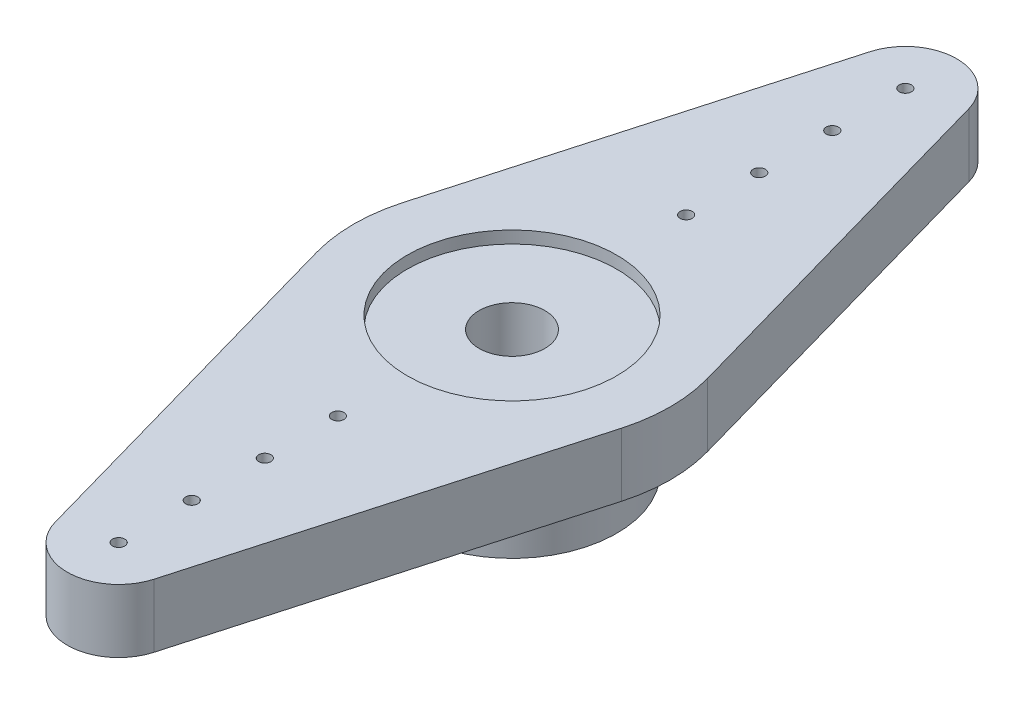
ISO-10303-21;
HEADER;
FILE_DESCRIPTION(('STEP AP214'),'2;1');
FILE_NAME('part.step','',(''),(''),'','','');
FILE_SCHEMA(('AUTOMOTIVE_DESIGN { 1 0 10303 214 1 1 1 1 }'));
ENDSEC;
DATA;
#1=APPLICATION_CONTEXT('core data for automotive mechanical design processes');
#2=APPLICATION_PROTOCOL_DEFINITION('international standard','automotive_design',2000,#1);
#3=PRODUCT_CONTEXT('',#1,'mechanical');
#4=PRODUCT('Part','Part','',(#3));
#5=PRODUCT_RELATED_PRODUCT_CATEGORY('part','',(#4));
#6=PRODUCT_DEFINITION_FORMATION('','',#4);
#7=PRODUCT_DEFINITION_CONTEXT('part definition',#1,'design');
#8=PRODUCT_DEFINITION('design','',#6,#7);
#9=PRODUCT_DEFINITION_SHAPE('','',#8);
#10=(LENGTH_UNIT() NAMED_UNIT(*) SI_UNIT(.MILLI.,.METRE.));
#11=(NAMED_UNIT(*) PLANE_ANGLE_UNIT() SI_UNIT($,.RADIAN.));
#12=(NAMED_UNIT(*) SI_UNIT($,.STERADIAN.) SOLID_ANGLE_UNIT());
#13=UNCERTAINTY_MEASURE_WITH_UNIT(LENGTH_MEASURE(1.E-05),#10,'distance_accuracy_value','');
#14=(GEOMETRIC_REPRESENTATION_CONTEXT(3) GLOBAL_UNCERTAINTY_ASSIGNED_CONTEXT((#13)) GLOBAL_UNIT_ASSIGNED_CONTEXT((#10,
#11,#12)) REPRESENTATION_CONTEXT('',''));
#15=CARTESIAN_POINT('',(0.,0.,0.));
#16=DIRECTION('',(0.,0.,1.));
#17=DIRECTION('',(1.,0.,0.));
#18=AXIS2_PLACEMENT_3D('',#15,#16,#17);
#19=CARTESIAN_POINT('',(0.,3.,0.));
#20=DIRECTION('',(0.,-1.,0.));
#21=DIRECTION('',(0.,0.,-1.));
#22=AXIS2_PLACEMENT_3D('',#19,#20,#21);
#23=CYLINDRICAL_SURFACE('',#22,4.3);
#24=CARTESIAN_POINT('',(0.,0.,0.));
#25=DIRECTION('',(0.,1.,0.));
#26=DIRECTION('',(0.,0.,1.));
#27=AXIS2_PLACEMENT_3D('',#24,#25,#26);
#28=CIRCLE('',#27,4.3);
#29=CARTESIAN_POINT('',(0.,0.,4.3));
#30=VERTEX_POINT('',#29);
#31=EDGE_CURVE('E53',#30,#30,#28,.T.);
#32=ORIENTED_EDGE('',*,*,#31,.T.);
#33=EDGE_LOOP('',(#32));
#34=FACE_BOUND('',#33,.T.);
#35=CARTESIAN_POINT('',(0.,3.,0.));
#36=DIRECTION('',(0.,1.,0.));
#37=DIRECTION('',(0.,0.,1.));
#38=AXIS2_PLACEMENT_3D('',#35,#36,#37);
#39=CIRCLE('',#38,4.3);
#40=CARTESIAN_POINT('',(0.,3.,4.3));
#41=VERTEX_POINT('',#40);
#42=EDGE_CURVE('E11',#41,#41,#39,.T.);
#43=ORIENTED_EDGE('',*,*,#42,.F.);
#44=EDGE_LOOP('',(#43));
#45=FACE_BOUND('',#44,.T.);
#46=ADVANCED_FACE('F45',(#34,#45),#23,.T.);
#47=CARTESIAN_POINT('',(0.,0.,0.));
#48=DIRECTION('',(0.,1.,0.));
#49=DIRECTION('',(0.,0.,1.));
#50=AXIS2_PLACEMENT_3D('',#47,#48,#49);
#51=PLANE('',#50);
#52=ORIENTED_EDGE('',*,*,#31,.F.);
#53=EDGE_LOOP('',(#52));
#54=FACE_BOUND('',#53,.T.);
#55=CARTESIAN_POINT('',(0.,0.,0.));
#56=DIRECTION('',(0.,1.,0.));
#57=DIRECTION('',(0.,0.,1.));
#58=AXIS2_PLACEMENT_3D('',#55,#56,#57);
#59=CIRCLE('',#58,2.75);
#60=CARTESIAN_POINT('',(0.,0.,2.75));
#61=VERTEX_POINT('',#60);
#62=EDGE_CURVE('E258',#61,#61,#59,.T.);
#63=ORIENTED_EDGE('',*,*,#62,.T.);
#64=EDGE_LOOP('',(#63));
#65=FACE_BOUND('',#64,.T.);
#66=ADVANCED_FACE('F267',(#54,#65),#51,.F.);
#67=CARTESIAN_POINT('',(0.,3.,0.));
#68=DIRECTION('',(0.,-1.,0.));
#69=DIRECTION('',(0.,0.,-1.));
#70=AXIS2_PLACEMENT_3D('',#67,#68,#69);
#71=CYLINDRICAL_SURFACE('',#70,2.75);
#72=CARTESIAN_POINT('',(0.,3.,0.));
#73=DIRECTION('',(0.,1.,0.));
#74=DIRECTION('',(0.,0.,1.));
#75=AXIS2_PLACEMENT_3D('',#72,#73,#74);
#76=CIRCLE('',#75,2.75);
#77=CARTESIAN_POINT('',(0.,3.,2.75));
#78=VERTEX_POINT('',#77);
#79=EDGE_CURVE('E251',#78,#78,#76,.T.);
#80=ORIENTED_EDGE('',*,*,#79,.T.);
#81=EDGE_LOOP('',(#80));
#82=FACE_BOUND('',#81,.T.);
#83=ORIENTED_EDGE('',*,*,#62,.F.);
#84=EDGE_LOOP('',(#83));
#85=FACE_BOUND('',#84,.T.);
#86=ADVANCED_FACE('F270',(#82,#85),#71,.F.);
#87=CARTESIAN_POINT('',(0.,3.,0.));
#88=DIRECTION('',(0.,1.,0.));
#89=DIRECTION('',(0.,0.,1.));
#90=AXIS2_PLACEMENT_3D('',#87,#88,#89);
#91=PLANE('',#90);
#92=CARTESIAN_POINT('',(0.,3.,0.));
#93=DIRECTION('',(0.,1.,0.));
#94=DIRECTION('',(0.,0.,1.));
#95=AXIS2_PLACEMENT_3D('',#92,#93,#94);
#96=CIRCLE('',#95,1.35);
#97=CARTESIAN_POINT('',(0.,3.,1.35));
#98=VERTEX_POINT('',#97);
#99=EDGE_CURVE('E246',#98,#98,#96,.T.);
#100=ORIENTED_EDGE('',*,*,#99,.T.);
#101=EDGE_LOOP('',(#100));
#102=FACE_BOUND('',#101,.T.);
#103=ORIENTED_EDGE('',*,*,#79,.F.);
#104=EDGE_LOOP('',(#103));
#105=FACE_BOUND('',#104,.T.);
#106=ADVANCED_FACE('F274',(#102,#105),#91,.F.);
#107=CARTESIAN_POINT('',(0.,5.1,0.));
#108=DIRECTION('',(0.,1.,0.));
#109=DIRECTION('',(0.,0.,1.));
#110=AXIS2_PLACEMENT_3D('',#107,#108,#109);
#111=PLANE('',#110);
#112=CARTESIAN_POINT('',(0.,5.1,0.));
#113=DIRECTION('',(0.,1.,0.));
#114=DIRECTION('',(0.,0.,1.));
#115=AXIS2_PLACEMENT_3D('',#112,#113,#114);
#116=CIRCLE('',#115,4.3);
#117=CARTESIAN_POINT('',(0.,5.1,4.3));
#118=VERTEX_POINT('',#117);
#119=EDGE_CURVE('E120',#118,#118,#116,.F.);
#120=ORIENTED_EDGE('',*,*,#119,.F.);
#121=EDGE_LOOP('',(#120));
#122=FACE_BOUND('',#121,.T.);
#123=CARTESIAN_POINT('',(0.,5.1,0.));
#124=DIRECTION('',(0.,1.,0.));
#125=DIRECTION('',(0.,0.,1.));
#126=AXIS2_PLACEMENT_3D('',#123,#124,#125);
#127=CIRCLE('',#126,1.35);
#128=CARTESIAN_POINT('',(0.,5.1,1.35));
#129=VERTEX_POINT('',#128);
#130=EDGE_CURVE('E247',#129,#129,#127,.T.);
#131=ORIENTED_EDGE('',*,*,#130,.F.);
#132=EDGE_LOOP('',(#131));
#133=FACE_BOUND('',#132,.T.);
#134=ADVANCED_FACE('F281',(#122,#133),#111,.T.);
#135=CARTESIAN_POINT('',(0.,5.1,0.));
#136=DIRECTION('',(0.,-1.,0.));
#137=DIRECTION('',(0.,0.,-1.));
#138=AXIS2_PLACEMENT_3D('',#135,#136,#137);
#139=CYLINDRICAL_SURFACE('',#138,1.35);
#140=ORIENTED_EDGE('',*,*,#130,.T.);
#141=EDGE_LOOP('',(#140));
#142=FACE_BOUND('',#141,.T.);
#143=ORIENTED_EDGE('',*,*,#99,.F.);
#144=EDGE_LOOP('',(#143));
#145=FACE_BOUND('',#144,.T.);
#146=ADVANCED_FACE('F300',(#142,#145),#139,.F.);
#147=CARTESIAN_POINT('',(0.,5.6,-16.15));
#148=DIRECTION('',(0.,1.,0.));
#149=DIRECTION('',(0.,0.,1.));
#150=AXIS2_PLACEMENT_3D('',#147,#148,#149);
#151=PLANE('',#150);
#152=CARTESIAN_POINT('',(0.,5.6,13.15));
#153=DIRECTION('',(0.,1.,0.));
#154=DIRECTION('',(0.,0.,-1.));
#155=AXIS2_PLACEMENT_3D('',#152,#153,#154);
#156=CIRCLE('',#155,0.249999999999999);
#157=CARTESIAN_POINT('',(0.,5.6,12.9));
#158=VERTEX_POINT('',#157);
#159=EDGE_CURVE('E171',#158,#158,#156,.T.);
#160=ORIENTED_EDGE('',*,*,#159,.F.);
#161=EDGE_LOOP('',(#160));
#162=FACE_BOUND('',#161,.T.);
#163=CARTESIAN_POINT('',(0.,5.6,7.15000000000004));
#164=DIRECTION('',(0.,1.,0.));
#165=DIRECTION('',(0.,0.,-1.));
#166=AXIS2_PLACEMENT_3D('',#163,#164,#165);
#167=CIRCLE('',#166,0.25);
#168=CARTESIAN_POINT('',(0.,5.6,6.90000000000004));
#169=VERTEX_POINT('',#168);
#170=EDGE_CURVE('E179',#169,#169,#167,.T.);
#171=ORIENTED_EDGE('',*,*,#170,.F.);
#172=EDGE_LOOP('',(#171));
#173=FACE_BOUND('',#172,.T.);
#174=CARTESIAN_POINT('',(0.,5.6,-10.15));
#175=DIRECTION('',(0.,1.,0.));
#176=DIRECTION('',(0.,0.,1.));
#177=AXIS2_PLACEMENT_3D('',#174,#175,#176);
#178=CIRCLE('',#177,0.25);
#179=CARTESIAN_POINT('',(0.,5.6,-9.9));
#180=VERTEX_POINT('',#179);
#181=EDGE_CURVE('E187',#180,#180,#178,.T.);
#182=ORIENTED_EDGE('',*,*,#181,.F.);
#183=EDGE_LOOP('',(#182));
#184=FACE_BOUND('',#183,.T.);
#185=CARTESIAN_POINT('',(0.,5.6,-16.15));
#186=DIRECTION('',(0.,1.,0.));
#187=DIRECTION('',(0.,0.,1.));
#188=AXIS2_PLACEMENT_3D('',#185,#186,#187);
#189=CIRCLE('',#188,0.25);
#190=CARTESIAN_POINT('',(0.,5.6,-15.9));
#191=VERTEX_POINT('',#190);
#192=EDGE_CURVE('E195',#191,#191,#189,.T.);
#193=ORIENTED_EDGE('',*,*,#192,.F.);
#194=EDGE_LOOP('',(#193));
#195=FACE_BOUND('',#194,.T.);
#196=CARTESIAN_POINT('',(0.,5.6,-16.15));
#197=DIRECTION('',(0.,1.,0.));
#198=DIRECTION('',(0.,0.,1.));
#199=AXIS2_PLACEMENT_3D('',#196,#197,#198);
#200=CIRCLE('',#199,2.11);
#201=CARTESIAN_POINT('',(2.03055056649711,5.6,-16.7235541795666));
#202=VERTEX_POINT('',#201);
#203=CARTESIAN_POINT('',(-2.03055056649711,5.6,-16.7235541795666));
#204=VERTEX_POINT('',#203);
#205=EDGE_CURVE('E203',#202,#204,#200,.T.);
#206=ORIENTED_EDGE('',*,*,#205,.T.);
#207=DIRECTION('',(-0.271826625386997,0.,0.962346240046023));
#208=VECTOR('',#207,1.);
#209=CARTESIAN_POINT('',(-2.03055056649711,5.6,-16.7235541795666));
#210=LINE('',#209,#208);
#211=CARTESIAN_POINT('',(-6.25525056029915,5.6,-1.76687306501548));
#212=VERTEX_POINT('',#211);
#213=EDGE_CURVE('E115',#204,#212,#210,.T.);
#214=ORIENTED_EDGE('',*,*,#213,.T.);
#215=CARTESIAN_POINT('',(0.,5.6,0.));
#216=DIRECTION('',(0.,1.,0.));
#217=DIRECTION('',(0.,0.,1.));
#218=AXIS2_PLACEMENT_3D('',#215,#216,#217);
#219=CIRCLE('',#218,6.50000000000001);
#220=CARTESIAN_POINT('',(-6.25525056029913,5.6,1.76687306501557));
#221=VERTEX_POINT('',#220);
#222=EDGE_CURVE('E208',#212,#221,#219,.T.);
#223=ORIENTED_EDGE('',*,*,#222,.T.);
#224=DIRECTION('',(0.271826625387004,0.,0.962346240046021));
#225=VECTOR('',#224,1.);
#226=CARTESIAN_POINT('',(-2.03055056649699,5.6,16.7235541795666));
#227=LINE('',#226,#225);
#228=CARTESIAN_POINT('',(-2.03055056649699,5.6,16.7235541795666));
#229=VERTEX_POINT('',#228);
#230=EDGE_CURVE('E211',#221,#229,#227,.T.);
#231=ORIENTED_EDGE('',*,*,#230,.T.);
#232=CARTESIAN_POINT('',(1.12757025938492E-13,5.6,16.15));
#233=DIRECTION('',(0.,1.,0.));
#234=DIRECTION('',(0.,0.,-1.));
#235=AXIS2_PLACEMENT_3D('',#232,#233,#234);
#236=CIRCLE('',#235,2.11);
#237=CARTESIAN_POINT('',(2.03055056649723,5.6,16.7235541795666));
#238=VERTEX_POINT('',#237);
#239=EDGE_CURVE('E214',#229,#238,#236,.T.);
#240=ORIENTED_EDGE('',*,*,#239,.T.);
#241=DIRECTION('',(0.27182662538699,0.,-0.962346240046025));
#242=VECTOR('',#241,1.);
#243=CARTESIAN_POINT('',(2.03055056649723,5.6,16.7235541795666));
#244=LINE('',#243,#242);
#245=CARTESIAN_POINT('',(6.25525056029916,5.6,1.76687306501548));
#246=VERTEX_POINT('',#245);
#247=EDGE_CURVE('E217',#238,#246,#244,.T.);
#248=ORIENTED_EDGE('',*,*,#247,.T.);
#249=CARTESIAN_POINT('',(0.,5.6,0.));
#250=DIRECTION('',(0.,1.,0.));
#251=DIRECTION('',(0.,0.,1.));
#252=AXIS2_PLACEMENT_3D('',#249,#250,#251);
#253=CIRCLE('',#252,6.50000000000001);
#254=CARTESIAN_POINT('',(6.25525056029916,5.6,-1.76687306501548));
#255=VERTEX_POINT('',#254);
#256=EDGE_CURVE('E65',#246,#255,#253,.T.);
#257=ORIENTED_EDGE('',*,*,#256,.T.);
#258=DIRECTION('',(-0.271826625386997,0.,-0.962346240046023));
#259=VECTOR('',#258,1.);
#260=CARTESIAN_POINT('',(2.03055056649711,5.6,-16.7235541795666));
#261=LINE('',#260,#259);
#262=EDGE_CURVE('E60',#255,#202,#261,.T.);
#263=ORIENTED_EDGE('',*,*,#262,.T.);
#264=EDGE_LOOP('',(#206,#214,#223,#231,#240,#248,#257,#263));
#265=FACE_BOUND('',#264,.T.);
#266=CARTESIAN_POINT('',(0.,5.6,0.));
#267=DIRECTION('',(0.,1.,0.));
#268=DIRECTION('',(0.,0.,1.));
#269=AXIS2_PLACEMENT_3D('',#266,#267,#268);
#270=CIRCLE('',#269,4.3);
#271=CARTESIAN_POINT('',(0.,5.6,4.3));
#272=VERTEX_POINT('',#271);
#273=EDGE_CURVE('E199',#272,#272,#270,.T.);
#274=ORIENTED_EDGE('',*,*,#273,.F.);
#275=EDGE_LOOP('',(#274));
#276=FACE_BOUND('',#275,.T.);
#277=CARTESIAN_POINT('',(0.,5.6,-13.15));
#278=DIRECTION('',(0.,1.,0.));
#279=DIRECTION('',(0.,0.,1.));
#280=AXIS2_PLACEMENT_3D('',#277,#278,#279);
#281=CIRCLE('',#280,0.25);
#282=CARTESIAN_POINT('',(0.,5.6,-12.9));
#283=VERTEX_POINT('',#282);
#284=EDGE_CURVE('E191',#283,#283,#281,.T.);
#285=ORIENTED_EDGE('',*,*,#284,.F.);
#286=EDGE_LOOP('',(#285));
#287=FACE_BOUND('',#286,.T.);
#288=CARTESIAN_POINT('',(0.,5.6,-7.15));
#289=DIRECTION('',(0.,1.,0.));
#290=DIRECTION('',(0.,0.,1.));
#291=AXIS2_PLACEMENT_3D('',#288,#289,#290);
#292=CIRCLE('',#291,0.25);
#293=CARTESIAN_POINT('',(0.,5.6,-6.9));
#294=VERTEX_POINT('',#293);
#295=EDGE_CURVE('E183',#294,#294,#292,.T.);
#296=ORIENTED_EDGE('',*,*,#295,.F.);
#297=EDGE_LOOP('',(#296));
#298=FACE_BOUND('',#297,.T.);
#299=CARTESIAN_POINT('',(0.,5.6,10.15));
#300=DIRECTION('',(0.,1.,0.));
#301=DIRECTION('',(0.,0.,-1.));
#302=AXIS2_PLACEMENT_3D('',#299,#300,#301);
#303=CIRCLE('',#302,0.249999999999999);
#304=CARTESIAN_POINT('',(0.,5.6,9.90000000000004));
#305=VERTEX_POINT('',#304);
#306=EDGE_CURVE('E175',#305,#305,#303,.T.);
#307=ORIENTED_EDGE('',*,*,#306,.F.);
#308=EDGE_LOOP('',(#307));
#309=FACE_BOUND('',#308,.T.);
#310=CARTESIAN_POINT('',(1.12757025938492E-13,5.6,16.15));
#311=DIRECTION('',(0.,1.,0.));
#312=DIRECTION('',(0.,0.,-1.));
#313=AXIS2_PLACEMENT_3D('',#310,#311,#312);
#314=CIRCLE('',#313,0.25);
#315=CARTESIAN_POINT('',(1.12757025938492E-13,5.6,15.9));
#316=VERTEX_POINT('',#315);
#317=EDGE_CURVE('E167',#316,#316,#314,.T.);
#318=ORIENTED_EDGE('',*,*,#317,.F.);
#319=EDGE_LOOP('',(#318));
#320=FACE_BOUND('',#319,.T.);
#321=ADVANCED_FACE('F306',(#162,#173,#184,#195,#265,#276,#287,#298,#309,#320),#151,.T.);
#322=CARTESIAN_POINT('',(0.,5.6,-16.15));
#323=DIRECTION('',(0.,-1.,0.));
#324=DIRECTION('',(0.,0.,-1.));
#325=AXIS2_PLACEMENT_3D('',#322,#323,#324);
#326=CYLINDRICAL_SURFACE('',#325,2.11);
#327=DIRECTION('',(0.,-1.,0.));
#328=VECTOR('',#327,1.);
#329=CARTESIAN_POINT('',(2.03055056649711,5.6,-16.7235541795666));
#330=LINE('',#329,#328);
#331=CARTESIAN_POINT('',(2.03055056649711,3.,-16.7235541795666));
#332=VERTEX_POINT('',#331);
#333=EDGE_CURVE('E136',#202,#332,#330,.T.);
#334=ORIENTED_EDGE('',*,*,#333,.T.);
#335=CARTESIAN_POINT('',(0.,3.,-16.15));
#336=DIRECTION('',(0.,1.,0.));
#337=DIRECTION('',(0.,0.,1.));
#338=AXIS2_PLACEMENT_3D('',#335,#336,#337);
#339=CIRCLE('',#338,2.11);
#340=CARTESIAN_POINT('',(-2.03055056649711,3.,-16.7235541795666));
#341=VERTEX_POINT('',#340);
#342=EDGE_CURVE('E128',#332,#341,#339,.T.);
#343=ORIENTED_EDGE('',*,*,#342,.T.);
#344=DIRECTION('',(0.,-1.,0.));
#345=VECTOR('',#344,1.);
#346=CARTESIAN_POINT('',(-2.03055056649711,5.6,-16.7235541795666));
#347=LINE('',#346,#345);
#348=EDGE_CURVE('E110',#204,#341,#347,.T.);
#349=ORIENTED_EDGE('',*,*,#348,.F.);
#350=ORIENTED_EDGE('',*,*,#205,.F.);
#351=EDGE_LOOP('',(#334,#343,#349,#350));
#352=FACE_BOUND('',#351,.T.);
#353=ADVANCED_FACE('F135',(#352),#326,.T.);
#354=CARTESIAN_POINT('',(-2.03055056649711,5.6,-16.7235541795666));
#355=DIRECTION('',(0.962346240046023,0.,0.271826625386997));
#356=DIRECTION('',(0.271826625386997,0.,-0.962346240046023));
#357=AXIS2_PLACEMENT_3D('',#354,#355,#356);
#358=PLANE('',#357);
#359=ORIENTED_EDGE('',*,*,#348,.T.);
#360=DIRECTION('',(-0.271826625386997,0.,0.962346240046023));
#361=VECTOR('',#360,1.);
#362=CARTESIAN_POINT('',(-2.03055056649711,3.,-16.7235541795666));
#363=LINE('',#362,#361);
#364=CARTESIAN_POINT('',(-6.25525056029915,3.,-1.76687306501548));
#365=VERTEX_POINT('',#364);
#366=EDGE_CURVE('E114',#341,#365,#363,.T.);
#367=ORIENTED_EDGE('',*,*,#366,.T.);
#368=DIRECTION('',(0.,-1.,0.));
#369=VECTOR('',#368,1.);
#370=CARTESIAN_POINT('',(-6.25525056029915,5.6,-1.76687306501548));
#371=LINE('',#370,#369);
#372=EDGE_CURVE('E121',#212,#365,#371,.T.);
#373=ORIENTED_EDGE('',*,*,#372,.F.);
#374=ORIENTED_EDGE('',*,*,#213,.F.);
#375=EDGE_LOOP('',(#359,#367,#373,#374));
#376=FACE_BOUND('',#375,.T.);
#377=ADVANCED_FACE('F112',(#376),#358,.F.);
#378=CARTESIAN_POINT('',(0.,5.6,0.));
#379=DIRECTION('',(0.,-1.,0.));
#380=DIRECTION('',(0.,0.,-1.));
#381=AXIS2_PLACEMENT_3D('',#378,#379,#380);
#382=CYLINDRICAL_SURFACE('',#381,6.50000000000001);
#383=ORIENTED_EDGE('',*,*,#372,.T.);
#384=CARTESIAN_POINT('',(0.,3.,0.));
#385=DIRECTION('',(0.,1.,0.));
#386=DIRECTION('',(0.,0.,1.));
#387=AXIS2_PLACEMENT_3D('',#384,#385,#386);
#388=CIRCLE('',#387,6.50000000000001);
#389=CARTESIAN_POINT('',(-6.25525056029913,3.,1.76687306501557));
#390=VERTEX_POINT('',#389);
#391=EDGE_CURVE('E132',#365,#390,#388,.T.);
#392=ORIENTED_EDGE('',*,*,#391,.T.);
#393=DIRECTION('',(0.,-1.,0.));
#394=VECTOR('',#393,1.);
#395=CARTESIAN_POINT('',(-6.25525056029913,5.6,1.76687306501557));
#396=LINE('',#395,#394);
#397=EDGE_CURVE('E238',#221,#390,#396,.T.);
#398=ORIENTED_EDGE('',*,*,#397,.F.);
#399=ORIENTED_EDGE('',*,*,#222,.F.);
#400=EDGE_LOOP('',(#383,#392,#398,#399));
#401=FACE_BOUND('',#400,.T.);
#402=ADVANCED_FACE('F328',(#401),#382,.T.);
#403=CARTESIAN_POINT('',(-2.03055056649699,5.6,16.7235541795666));
#404=DIRECTION('',(0.962346240046021,0.,-0.271826625387004));
#405=DIRECTION('',(-0.271826625387004,0.,-0.962346240046021));
#406=AXIS2_PLACEMENT_3D('',#403,#404,#405);
#407=PLANE('',#406);
#408=ORIENTED_EDGE('',*,*,#397,.T.);
#409=DIRECTION('',(0.271826625387004,0.,0.962346240046021));
#410=VECTOR('',#409,1.);
#411=CARTESIAN_POINT('',(-2.03055056649699,3.,16.7235541795666));
#412=LINE('',#411,#410);
#413=CARTESIAN_POINT('',(-2.03055056649699,3.,16.7235541795666));
#414=VERTEX_POINT('',#413);
#415=EDGE_CURVE('E148',#390,#414,#412,.T.);
#416=ORIENTED_EDGE('',*,*,#415,.T.);
#417=DIRECTION('',(0.,-1.,0.));
#418=VECTOR('',#417,1.);
#419=CARTESIAN_POINT('',(-2.03055056649699,5.6,16.7235541795666));
#420=LINE('',#419,#418);
#421=EDGE_CURVE('E235',#229,#414,#420,.T.);
#422=ORIENTED_EDGE('',*,*,#421,.F.);
#423=ORIENTED_EDGE('',*,*,#230,.F.);
#424=EDGE_LOOP('',(#408,#416,#422,#423));
#425=FACE_BOUND('',#424,.T.);
#426=ADVANCED_FACE('F336',(#425),#407,.F.);
#427=CARTESIAN_POINT('',(1.12757025938492E-13,5.6,16.15));
#428=DIRECTION('',(0.,-1.,0.));
#429=DIRECTION('',(0.,0.,-1.));
#430=AXIS2_PLACEMENT_3D('',#427,#428,#429);
#431=CYLINDRICAL_SURFACE('',#430,2.11);
#432=ORIENTED_EDGE('',*,*,#421,.T.);
#433=CARTESIAN_POINT('',(1.12757025938492E-13,3.,16.15));
#434=DIRECTION('',(0.,1.,0.));
#435=DIRECTION('',(0.,0.,-1.));
#436=AXIS2_PLACEMENT_3D('',#433,#434,#435);
#437=CIRCLE('',#436,2.11);
#438=CARTESIAN_POINT('',(2.03055056649723,3.,16.7235541795666));
#439=VERTEX_POINT('',#438);
#440=EDGE_CURVE('E152',#414,#439,#437,.T.);
#441=ORIENTED_EDGE('',*,*,#440,.T.);
#442=DIRECTION('',(0.,-1.,0.));
#443=VECTOR('',#442,1.);
#444=CARTESIAN_POINT('',(2.03055056649723,5.6,16.7235541795666));
#445=LINE('',#444,#443);
#446=EDGE_CURVE('E232',#238,#439,#445,.T.);
#447=ORIENTED_EDGE('',*,*,#446,.F.);
#448=ORIENTED_EDGE('',*,*,#239,.F.);
#449=EDGE_LOOP('',(#432,#441,#447,#448));
#450=FACE_BOUND('',#449,.T.);
#451=ADVANCED_FACE('F345',(#450),#431,.T.);
#452=CARTESIAN_POINT('',(2.03055056649723,5.6,16.7235541795666));
#453=DIRECTION('',(-0.962346240046025,0.,-0.27182662538699));
#454=DIRECTION('',(-0.27182662538699,0.,0.962346240046025));
#455=AXIS2_PLACEMENT_3D('',#452,#453,#454);
#456=PLANE('',#455);
#457=ORIENTED_EDGE('',*,*,#446,.T.);
#458=DIRECTION('',(0.27182662538699,0.,-0.962346240046025));
#459=VECTOR('',#458,1.);
#460=CARTESIAN_POINT('',(2.03055056649723,3.,16.7235541795666));
#461=LINE('',#460,#459);
#462=CARTESIAN_POINT('',(6.25525056029916,3.,1.76687306501548));
#463=VERTEX_POINT('',#462);
#464=EDGE_CURVE('E156',#439,#463,#461,.T.);
#465=ORIENTED_EDGE('',*,*,#464,.T.);
#466=DIRECTION('',(0.,-1.,0.));
#467=VECTOR('',#466,1.);
#468=CARTESIAN_POINT('',(6.25525056029916,5.6,1.76687306501548));
#469=LINE('',#468,#467);
#470=EDGE_CURVE('E229',#246,#463,#469,.T.);
#471=ORIENTED_EDGE('',*,*,#470,.F.);
#472=ORIENTED_EDGE('',*,*,#247,.F.);
#473=EDGE_LOOP('',(#457,#465,#471,#472));
#474=FACE_BOUND('',#473,.T.);
#475=ADVANCED_FACE('F354',(#474),#456,.F.);
#476=CARTESIAN_POINT('',(0.,5.6,0.));
#477=DIRECTION('',(0.,-1.,0.));
#478=DIRECTION('',(0.,0.,-1.));
#479=AXIS2_PLACEMENT_3D('',#476,#477,#478);
#480=CYLINDRICAL_SURFACE('',#479,6.50000000000001);
#481=ORIENTED_EDGE('',*,*,#470,.T.);
#482=CARTESIAN_POINT('',(0.,3.,0.));
#483=DIRECTION('',(0.,1.,0.));
#484=DIRECTION('',(0.,0.,1.));
#485=AXIS2_PLACEMENT_3D('',#482,#483,#484);
#486=CIRCLE('',#485,6.50000000000001);
#487=CARTESIAN_POINT('',(6.25525056029916,3.,-1.76687306501548));
#488=VERTEX_POINT('',#487);
#489=EDGE_CURVE('E160',#463,#488,#486,.T.);
#490=ORIENTED_EDGE('',*,*,#489,.T.);
#491=DIRECTION('',(0.,-1.,0.));
#492=VECTOR('',#491,1.);
#493=CARTESIAN_POINT('',(6.25525056029916,5.6,-1.76687306501548));
#494=LINE('',#493,#492);
#495=EDGE_CURVE('E226',#255,#488,#494,.T.);
#496=ORIENTED_EDGE('',*,*,#495,.F.);
#497=ORIENTED_EDGE('',*,*,#256,.F.);
#498=EDGE_LOOP('',(#481,#490,#496,#497));
#499=FACE_BOUND('',#498,.T.);
#500=ADVANCED_FACE('F363',(#499),#480,.T.);
#501=CARTESIAN_POINT('',(2.03055056649711,5.6,-16.7235541795666));
#502=DIRECTION('',(-0.962346240046023,0.,0.271826625386997));
#503=DIRECTION('',(0.271826625386997,0.,0.962346240046023));
#504=AXIS2_PLACEMENT_3D('',#501,#502,#503);
#505=PLANE('',#504);
#506=ORIENTED_EDGE('',*,*,#495,.T.);
#507=DIRECTION('',(-0.271826625386997,0.,-0.962346240046023));
#508=VECTOR('',#507,1.);
#509=CARTESIAN_POINT('',(2.03055056649711,3.,-16.7235541795666));
#510=LINE('',#509,#508);
#511=EDGE_CURVE('E164',#488,#332,#510,.T.);
#512=ORIENTED_EDGE('',*,*,#511,.T.);
#513=ORIENTED_EDGE('',*,*,#333,.F.);
#514=ORIENTED_EDGE('',*,*,#262,.F.);
#515=EDGE_LOOP('',(#506,#512,#513,#514));
#516=FACE_BOUND('',#515,.T.);
#517=ADVANCED_FACE('F372',(#516),#505,.F.);
#518=CARTESIAN_POINT('',(0.,5.6,0.));
#519=DIRECTION('',(0.,-1.,0.));
#520=DIRECTION('',(0.,0.,-1.));
#521=AXIS2_PLACEMENT_3D('',#518,#519,#520);
#522=CYLINDRICAL_SURFACE('',#521,4.3);
#523=ORIENTED_EDGE('',*,*,#119,.T.);
#524=EDGE_LOOP('',(#523));
#525=FACE_BOUND('',#524,.T.);
#526=ORIENTED_EDGE('',*,*,#273,.T.);
#527=EDGE_LOOP('',(#526));
#528=FACE_BOUND('',#527,.T.);
#529=ADVANCED_FACE('F381',(#525,#528),#522,.F.);
#530=CARTESIAN_POINT('',(0.,5.6,-16.15));
#531=DIRECTION('',(0.,-1.,0.));
#532=DIRECTION('',(0.,0.,-1.));
#533=AXIS2_PLACEMENT_3D('',#530,#531,#532);
#534=CYLINDRICAL_SURFACE('',#533,0.25);
#535=ORIENTED_EDGE('',*,*,#192,.T.);
#536=EDGE_LOOP('',(#535));
#537=FACE_BOUND('',#536,.T.);
#538=CARTESIAN_POINT('',(0.,3.,-16.15));
#539=DIRECTION('',(0.,1.,0.));
#540=DIRECTION('',(0.,0.,1.));
#541=AXIS2_PLACEMENT_3D('',#538,#539,#540);
#542=CIRCLE('',#541,0.25);
#543=CARTESIAN_POINT('',(0.,3.,-15.9));
#544=VERTEX_POINT('',#543);
#545=EDGE_CURVE('E138',#544,#544,#542,.T.);
#546=ORIENTED_EDGE('',*,*,#545,.F.);
#547=EDGE_LOOP('',(#546));
#548=FACE_BOUND('',#547,.T.);
#549=ADVANCED_FACE('F390',(#537,#548),#534,.F.);
#550=CARTESIAN_POINT('',(0.,5.6,-13.15));
#551=DIRECTION('',(0.,-1.,0.));
#552=DIRECTION('',(0.,0.,-1.));
#553=AXIS2_PLACEMENT_3D('',#550,#551,#552);
#554=CYLINDRICAL_SURFACE('',#553,0.25);
#555=ORIENTED_EDGE('',*,*,#284,.T.);
#556=EDGE_LOOP('',(#555));
#557=FACE_BOUND('',#556,.T.);
#558=CARTESIAN_POINT('',(0.,3.,-13.15));
#559=DIRECTION('',(0.,1.,0.));
#560=DIRECTION('',(0.,0.,1.));
#561=AXIS2_PLACEMENT_3D('',#558,#559,#560);
#562=CIRCLE('',#561,0.25);
#563=CARTESIAN_POINT('',(0.,3.,-12.9));
#564=VERTEX_POINT('',#563);
#565=EDGE_CURVE('E142',#564,#564,#562,.T.);
#566=ORIENTED_EDGE('',*,*,#565,.F.);
#567=EDGE_LOOP('',(#566));
#568=FACE_BOUND('',#567,.T.);
#569=ADVANCED_FACE('F399',(#557,#568),#554,.F.);
#570=CARTESIAN_POINT('',(0.,5.6,-10.15));
#571=DIRECTION('',(0.,-1.,0.));
#572=DIRECTION('',(0.,0.,-1.));
#573=AXIS2_PLACEMENT_3D('',#570,#571,#572);
#574=CYLINDRICAL_SURFACE('',#573,0.25);
#575=ORIENTED_EDGE('',*,*,#181,.T.);
#576=EDGE_LOOP('',(#575));
#577=FACE_BOUND('',#576,.T.);
#578=CARTESIAN_POINT('',(0.,3.,-10.15));
#579=DIRECTION('',(0.,1.,0.));
#580=DIRECTION('',(0.,0.,1.));
#581=AXIS2_PLACEMENT_3D('',#578,#579,#580);
#582=CIRCLE('',#581,0.25);
#583=CARTESIAN_POINT('',(0.,3.,-9.9));
#584=VERTEX_POINT('',#583);
#585=EDGE_CURVE('E516',#584,#584,#582,.T.);
#586=ORIENTED_EDGE('',*,*,#585,.F.);
#587=EDGE_LOOP('',(#586));
#588=FACE_BOUND('',#587,.T.);
#589=ADVANCED_FACE('F408',(#577,#588),#574,.F.);
#590=CARTESIAN_POINT('',(0.,5.6,-7.15));
#591=DIRECTION('',(0.,-1.,0.));
#592=DIRECTION('',(0.,0.,-1.));
#593=AXIS2_PLACEMENT_3D('',#590,#591,#592);
#594=CYLINDRICAL_SURFACE('',#593,0.25);
#595=ORIENTED_EDGE('',*,*,#295,.T.);
#596=EDGE_LOOP('',(#595));
#597=FACE_BOUND('',#596,.T.);
#598=CARTESIAN_POINT('',(0.,3.,-7.15));
#599=DIRECTION('',(0.,1.,0.));
#600=DIRECTION('',(0.,0.,1.));
#601=AXIS2_PLACEMENT_3D('',#598,#599,#600);
#602=CIRCLE('',#601,0.25);
#603=CARTESIAN_POINT('',(0.,3.,-6.9));
#604=VERTEX_POINT('',#603);
#605=EDGE_CURVE('E512',#604,#604,#602,.T.);
#606=ORIENTED_EDGE('',*,*,#605,.F.);
#607=EDGE_LOOP('',(#606));
#608=FACE_BOUND('',#607,.T.);
#609=ADVANCED_FACE('F417',(#597,#608),#594,.F.);
#610=CARTESIAN_POINT('',(0.,5.6,7.15000000000004));
#611=DIRECTION('',(0.,-1.,0.));
#612=DIRECTION('',(0.,0.,-1.));
#613=AXIS2_PLACEMENT_3D('',#610,#611,#612);
#614=CYLINDRICAL_SURFACE('',#613,0.25);
#615=ORIENTED_EDGE('',*,*,#170,.T.);
#616=EDGE_LOOP('',(#615));
#617=FACE_BOUND('',#616,.T.);
#618=CARTESIAN_POINT('',(0.,3.,7.15000000000004));
#619=DIRECTION('',(0.,1.,0.));
#620=DIRECTION('',(0.,0.,-1.));
#621=AXIS2_PLACEMENT_3D('',#618,#619,#620);
#622=CIRCLE('',#621,0.25);
#623=CARTESIAN_POINT('',(0.,3.,6.90000000000004));
#624=VERTEX_POINT('',#623);
#625=EDGE_CURVE('E508',#624,#624,#622,.T.);
#626=ORIENTED_EDGE('',*,*,#625,.F.);
#627=EDGE_LOOP('',(#626));
#628=FACE_BOUND('',#627,.T.);
#629=ADVANCED_FACE('F426',(#617,#628),#614,.F.);
#630=CARTESIAN_POINT('',(0.,5.6,10.15));
#631=DIRECTION('',(0.,-1.,0.));
#632=DIRECTION('',(0.,0.,-1.));
#633=AXIS2_PLACEMENT_3D('',#630,#631,#632);
#634=CYLINDRICAL_SURFACE('',#633,0.249999999999999);
#635=ORIENTED_EDGE('',*,*,#306,.T.);
#636=EDGE_LOOP('',(#635));
#637=FACE_BOUND('',#636,.T.);
#638=CARTESIAN_POINT('',(0.,3.,10.15));
#639=DIRECTION('',(0.,1.,0.));
#640=DIRECTION('',(0.,0.,-1.));
#641=AXIS2_PLACEMENT_3D('',#638,#639,#640);
#642=CIRCLE('',#641,0.249999999999999);
#643=CARTESIAN_POINT('',(0.,3.,9.90000000000004));
#644=VERTEX_POINT('',#643);
#645=EDGE_CURVE('E504',#644,#644,#642,.T.);
#646=ORIENTED_EDGE('',*,*,#645,.F.);
#647=EDGE_LOOP('',(#646));
#648=FACE_BOUND('',#647,.T.);
#649=ADVANCED_FACE('F435',(#637,#648),#634,.F.);
#650=CARTESIAN_POINT('',(0.,5.6,13.15));
#651=DIRECTION('',(0.,-1.,0.));
#652=DIRECTION('',(0.,0.,-1.));
#653=AXIS2_PLACEMENT_3D('',#650,#651,#652);
#654=CYLINDRICAL_SURFACE('',#653,0.249999999999999);
#655=ORIENTED_EDGE('',*,*,#159,.T.);
#656=EDGE_LOOP('',(#655));
#657=FACE_BOUND('',#656,.T.);
#658=CARTESIAN_POINT('',(0.,3.,13.15));
#659=DIRECTION('',(0.,1.,0.));
#660=DIRECTION('',(0.,0.,-1.));
#661=AXIS2_PLACEMENT_3D('',#658,#659,#660);
#662=CIRCLE('',#661,0.249999999999999);
#663=CARTESIAN_POINT('',(0.,3.,12.9));
#664=VERTEX_POINT('',#663);
#665=EDGE_CURVE('E500',#664,#664,#662,.T.);
#666=ORIENTED_EDGE('',*,*,#665,.F.);
#667=EDGE_LOOP('',(#666));
#668=FACE_BOUND('',#667,.T.);
#669=ADVANCED_FACE('F444',(#657,#668),#654,.F.);
#670=CARTESIAN_POINT('',(1.12757025938492E-13,5.6,16.15));
#671=DIRECTION('',(0.,-1.,0.));
#672=DIRECTION('',(0.,0.,-1.));
#673=AXIS2_PLACEMENT_3D('',#670,#671,#672);
#674=CYLINDRICAL_SURFACE('',#673,0.25);
#675=ORIENTED_EDGE('',*,*,#317,.T.);
#676=EDGE_LOOP('',(#675));
#677=FACE_BOUND('',#676,.T.);
#678=CARTESIAN_POINT('',(1.12757025938492E-13,3.,16.15));
#679=DIRECTION('',(0.,1.,0.));
#680=DIRECTION('',(0.,0.,-1.));
#681=AXIS2_PLACEMENT_3D('',#678,#679,#680);
#682=CIRCLE('',#681,0.25);
#683=CARTESIAN_POINT('',(1.12757025938492E-13,3.,15.9));
#684=VERTEX_POINT('',#683);
#685=EDGE_CURVE('E496',#684,#684,#682,.T.);
#686=ORIENTED_EDGE('',*,*,#685,.F.);
#687=EDGE_LOOP('',(#686));
#688=FACE_BOUND('',#687,.T.);
#689=ADVANCED_FACE('F453',(#677,#688),#674,.F.);
#690=CARTESIAN_POINT('',(0.,3.,-16.15));
#691=DIRECTION('',(0.,1.,0.));
#692=DIRECTION('',(0.,0.,1.));
#693=AXIS2_PLACEMENT_3D('',#690,#691,#692);
#694=PLANE('',#693);
#695=ORIENTED_EDGE('',*,*,#685,.T.);
#696=EDGE_LOOP('',(#695));
#697=FACE_BOUND('',#696,.T.);
#698=ORIENTED_EDGE('',*,*,#665,.T.);
#699=EDGE_LOOP('',(#698));
#700=FACE_BOUND('',#699,.T.);
#701=ORIENTED_EDGE('',*,*,#645,.T.);
#702=EDGE_LOOP('',(#701));
#703=FACE_BOUND('',#702,.T.);
#704=ORIENTED_EDGE('',*,*,#625,.T.);
#705=EDGE_LOOP('',(#704));
#706=FACE_BOUND('',#705,.T.);
#707=ORIENTED_EDGE('',*,*,#605,.T.);
#708=EDGE_LOOP('',(#707));
#709=FACE_BOUND('',#708,.T.);
#710=ORIENTED_EDGE('',*,*,#585,.T.);
#711=EDGE_LOOP('',(#710));
#712=FACE_BOUND('',#711,.T.);
#713=ORIENTED_EDGE('',*,*,#565,.T.);
#714=EDGE_LOOP('',(#713));
#715=FACE_BOUND('',#714,.T.);
#716=ORIENTED_EDGE('',*,*,#545,.T.);
#717=EDGE_LOOP('',(#716));
#718=FACE_BOUND('',#717,.T.);
#719=ORIENTED_EDGE('',*,*,#42,.T.);
#720=EDGE_LOOP('',(#719));
#721=FACE_BOUND('',#720,.T.);
#722=ORIENTED_EDGE('',*,*,#342,.F.);
#723=ORIENTED_EDGE('',*,*,#511,.F.);
#724=ORIENTED_EDGE('',*,*,#489,.F.);
#725=ORIENTED_EDGE('',*,*,#464,.F.);
#726=ORIENTED_EDGE('',*,*,#440,.F.);
#727=ORIENTED_EDGE('',*,*,#415,.F.);
#728=ORIENTED_EDGE('',*,*,#391,.F.);
#729=ORIENTED_EDGE('',*,*,#366,.F.);
#730=EDGE_LOOP('',(#722,#723,#724,#725,#726,#727,#728,#729));
#731=FACE_BOUND('',#730,.T.);
#732=ADVANCED_FACE('F126',(#697,#700,#703,#706,#709,#712,#715,#718,#721,#731),#694,.F.);
#733=CLOSED_SHELL('',(#46,#66,#86,#106,#134,#146,#321,#353,#377,#402,#426,#451,#475,#500,#517,
#529,#549,#569,#589,#609,#629,#649,#669,#689,#732));
#734=MANIFOLD_SOLID_BREP('B2',#733);
#735=ADVANCED_BREP_SHAPE_REPRESENTATION('',(#18,#734),#14);
#736=SHAPE_DEFINITION_REPRESENTATION(#9,#735);
ENDSEC;
END-ISO-10303-21;
